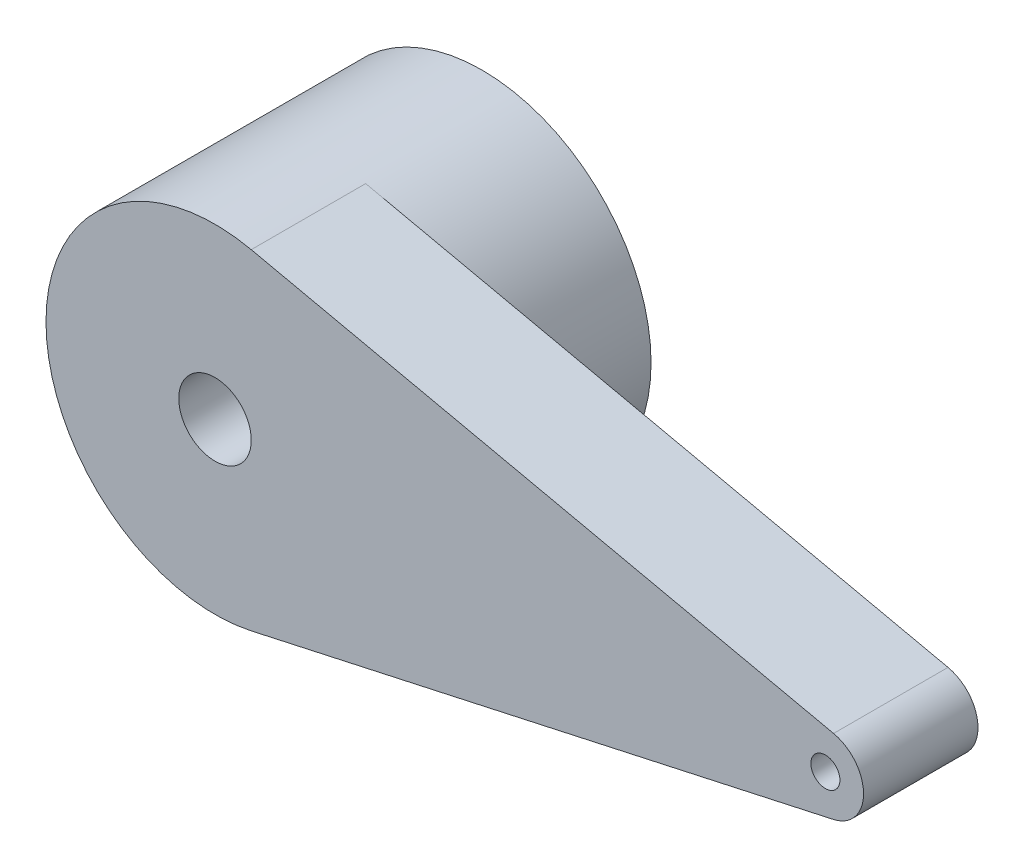
ISO-10303-21;
HEADER;
FILE_DESCRIPTION(('STEP AP214'),'2;1');
FILE_NAME('part.step','',(''),(''),'','','');
FILE_SCHEMA(('AUTOMOTIVE_DESIGN { 1 0 10303 214 1 1 1 1 }'));
ENDSEC;
DATA;
#1=APPLICATION_CONTEXT('core data for automotive mechanical design processes');
#2=APPLICATION_PROTOCOL_DEFINITION('international standard','automotive_design',2000,#1);
#3=PRODUCT_CONTEXT('',#1,'mechanical');
#4=PRODUCT('Part','Part','',(#3));
#5=PRODUCT_RELATED_PRODUCT_CATEGORY('part','',(#4));
#6=PRODUCT_DEFINITION_FORMATION('','',#4);
#7=PRODUCT_DEFINITION_CONTEXT('part definition',#1,'design');
#8=PRODUCT_DEFINITION('design','',#6,#7);
#9=PRODUCT_DEFINITION_SHAPE('','',#8);
#10=(LENGTH_UNIT() NAMED_UNIT(*) SI_UNIT(.MILLI.,.METRE.));
#11=(NAMED_UNIT(*) PLANE_ANGLE_UNIT() SI_UNIT($,.RADIAN.));
#12=(NAMED_UNIT(*) SI_UNIT($,.STERADIAN.) SOLID_ANGLE_UNIT());
#13=UNCERTAINTY_MEASURE_WITH_UNIT(LENGTH_MEASURE(1.E-05),#10,'distance_accuracy_value','');
#14=(GEOMETRIC_REPRESENTATION_CONTEXT(3) GLOBAL_UNCERTAINTY_ASSIGNED_CONTEXT((#13)) GLOBAL_UNIT_ASSIGNED_CONTEXT((#10,
#11,#12)) REPRESENTATION_CONTEXT('',''));
#15=CARTESIAN_POINT('',(0.,0.,0.));
#16=DIRECTION('',(0.,0.,1.));
#17=DIRECTION('',(1.,0.,0.));
#18=AXIS2_PLACEMENT_3D('',#15,#16,#17);
#19=CARTESIAN_POINT('',(0.,0.,0.));
#20=DIRECTION('',(0.,0.,1.));
#21=DIRECTION('',(1.,0.,0.));
#22=AXIS2_PLACEMENT_3D('',#19,#20,#21);
#23=PLANE('',#22);
#24=CARTESIAN_POINT('',(16.,0.,0.));
#25=DIRECTION('',(0.,0.,1.));
#26=DIRECTION('',(1.,0.,0.));
#27=AXIS2_PLACEMENT_3D('',#24,#25,#26);
#28=CIRCLE('',#27,0.380999999999998);
#29=CARTESIAN_POINT('',(16.381,0.,0.));
#30=VERTEX_POINT('',#29);
#31=EDGE_CURVE('E120',#30,#30,#28,.T.);
#32=ORIENTED_EDGE('',*,*,#31,.T.);
#33=EDGE_LOOP('',(#32));
#34=FACE_BOUND('',#33,.T.);
#35=CARTESIAN_POINT('',(0.,0.,0.));
#36=DIRECTION('',(0.,0.,-1.));
#37=DIRECTION('',(-1.,0.,0.));
#38=AXIS2_PLACEMENT_3D('',#35,#36,#37);
#39=CIRCLE('',#38,4.43);
#40=CARTESIAN_POINT('',(0.949681249999999,4.32700884253758,0.));
#41=VERTEX_POINT('',#40);
#42=CARTESIAN_POINT('',(0.949681250000001,-4.32700884253758,0.));
#43=VERTEX_POINT('',#42);
#44=EDGE_CURVE('E83',#41,#43,#39,.T.);
#45=ORIENTED_EDGE('',*,*,#44,.F.);
#46=DIRECTION('',(-0.976751431724059,0.214375,0.));
#47=VECTOR('',#46,1.);
#48=CARTESIAN_POINT('',(0.949681249999999,4.32700884253758,0.));
#49=LINE('',#48,#47);
#50=CARTESIAN_POINT('',(16.214375,0.976751431724059,0.));
#51=VERTEX_POINT('',#50);
#52=EDGE_CURVE('E85',#51,#41,#49,.T.);
#53=ORIENTED_EDGE('',*,*,#52,.F.);
#54=CARTESIAN_POINT('',(16.,0.,0.));
#55=DIRECTION('',(0.,0.,1.));
#56=DIRECTION('',(-1.,0.,0.));
#57=AXIS2_PLACEMENT_3D('',#54,#55,#56);
#58=CIRCLE('',#57,0.999999999999999);
#59=CARTESIAN_POINT('',(16.214375,-0.976751431724059,0.));
#60=VERTEX_POINT('',#59);
#61=EDGE_CURVE('E73',#60,#51,#58,.T.);
#62=ORIENTED_EDGE('',*,*,#61,.F.);
#63=DIRECTION('',(0.97675143172406,0.214375,0.));
#64=VECTOR('',#63,1.);
#65=CARTESIAN_POINT('',(16.214375,-0.976751431724059,0.));
#66=LINE('',#65,#64);
#67=EDGE_CURVE('E66',#43,#60,#66,.T.);
#68=ORIENTED_EDGE('',*,*,#67,.F.);
#69=EDGE_LOOP('',(#45,#53,#62,#68));
#70=FACE_BOUND('',#69,.T.);
#71=ADVANCED_FACE('F33',(#34,#70),#23,.F.);
#72=CARTESIAN_POINT('',(0.,0.,3.));
#73=DIRECTION('',(0.,0.,1.));
#74=DIRECTION('',(1.,0.,0.));
#75=AXIS2_PLACEMENT_3D('',#72,#73,#74);
#76=PLANE('',#75);
#77=CARTESIAN_POINT('',(16.,0.,3.));
#78=DIRECTION('',(0.,0.,1.));
#79=DIRECTION('',(1.,0.,0.));
#80=AXIS2_PLACEMENT_3D('',#77,#78,#79);
#81=CIRCLE('',#80,0.380999999999998);
#82=CARTESIAN_POINT('',(16.381,0.,3.));
#83=VERTEX_POINT('',#82);
#84=EDGE_CURVE('E111',#83,#83,#81,.T.);
#85=ORIENTED_EDGE('',*,*,#84,.F.);
#86=EDGE_LOOP('',(#85));
#87=FACE_BOUND('',#86,.T.);
#88=CARTESIAN_POINT('',(0.,0.,3.));
#89=DIRECTION('',(0.,0.,1.));
#90=DIRECTION('',(1.,0.,0.));
#91=AXIS2_PLACEMENT_3D('',#88,#89,#90);
#92=CIRCLE('',#91,4.43);
#93=CARTESIAN_POINT('',(0.949681249999999,4.32700884253758,3.));
#94=VERTEX_POINT('',#93);
#95=CARTESIAN_POINT('',(0.949681250000001,-4.32700884253758,3.));
#96=VERTEX_POINT('',#95);
#97=EDGE_CURVE('E97',#94,#96,#92,.T.);
#98=ORIENTED_EDGE('',*,*,#97,.T.);
#99=DIRECTION('',(0.97675143172406,0.214375,0.));
#100=VECTOR('',#99,1.);
#101=CARTESIAN_POINT('',(16.214375,-0.976751431724059,3.));
#102=LINE('',#101,#100);
#103=CARTESIAN_POINT('',(16.214375,-0.976751431724059,3.));
#104=VERTEX_POINT('',#103);
#105=EDGE_CURVE('E78',#96,#104,#102,.T.);
#106=ORIENTED_EDGE('',*,*,#105,.T.);
#107=CARTESIAN_POINT('',(16.,0.,3.));
#108=DIRECTION('',(0.,0.,1.));
#109=DIRECTION('',(-1.,0.,0.));
#110=AXIS2_PLACEMENT_3D('',#107,#108,#109);
#111=CIRCLE('',#110,0.999999999999999);
#112=CARTESIAN_POINT('',(16.214375,0.976751431724059,3.));
#113=VERTEX_POINT('',#112);
#114=EDGE_CURVE('E101',#104,#113,#111,.T.);
#115=ORIENTED_EDGE('',*,*,#114,.T.);
#116=DIRECTION('',(-0.976751431724059,0.214375,0.));
#117=VECTOR('',#116,1.);
#118=CARTESIAN_POINT('',(0.949681249999999,4.32700884253758,3.));
#119=LINE('',#118,#117);
#120=EDGE_CURVE('E52',#113,#94,#119,.T.);
#121=ORIENTED_EDGE('',*,*,#120,.T.);
#122=EDGE_LOOP('',(#98,#106,#115,#121));
#123=FACE_BOUND('',#122,.T.);
#124=CARTESIAN_POINT('',(0.,0.,3.));
#125=DIRECTION('',(0.,0.,1.));
#126=DIRECTION('',(1.,0.,0.));
#127=AXIS2_PLACEMENT_3D('',#124,#125,#126);
#128=CIRCLE('',#127,0.95);
#129=CARTESIAN_POINT('',(0.95,0.,3.));
#130=VERTEX_POINT('',#129);
#131=EDGE_CURVE('E117',#130,#130,#128,.T.);
#132=ORIENTED_EDGE('',*,*,#131,.F.);
#133=EDGE_LOOP('',(#132));
#134=FACE_BOUND('',#133,.T.);
#135=ADVANCED_FACE('F132',(#87,#123,#134),#76,.T.);
#136=CARTESIAN_POINT('',(0.,0.,0.));
#137=DIRECTION('',(0.,0.,-1.));
#138=DIRECTION('',(-1.,0.,0.));
#139=AXIS2_PLACEMENT_3D('',#136,#137,#138);
#140=CIRCLE('',#139,2.43);
#141=CARTESIAN_POINT('',(-2.43,0.,0.));
#142=VERTEX_POINT('',#141);
#143=EDGE_CURVE('E161',#142,#142,#140,.T.);
#144=ORIENTED_EDGE('',*,*,#143,.T.);
#145=EDGE_LOOP('',(#144));
#146=FACE_BOUND('',#145,.T.);
#147=CARTESIAN_POINT('',(0.,0.,0.));
#148=DIRECTION('',(0.,0.,1.));
#149=DIRECTION('',(1.,0.,0.));
#150=AXIS2_PLACEMENT_3D('',#147,#148,#149);
#151=CIRCLE('',#150,0.95);
#152=CARTESIAN_POINT('',(0.95,0.,0.));
#153=VERTEX_POINT('',#152);
#154=EDGE_CURVE('E121',#153,#153,#151,.T.);
#155=ORIENTED_EDGE('',*,*,#154,.T.);
#156=EDGE_LOOP('',(#155));
#157=FACE_BOUND('',#156,.T.);
#158=ADVANCED_FACE('F147',(#146,#157),#23,.F.);
#159=CARTESIAN_POINT('',(0.,0.,3.));
#160=DIRECTION('',(0.,0.,-1.));
#161=DIRECTION('',(-1.,0.,0.));
#162=AXIS2_PLACEMENT_3D('',#159,#160,#161);
#163=CYLINDRICAL_SURFACE('',#162,4.43);
#164=DIRECTION('',(0.,0.,-1.));
#165=VECTOR('',#164,1.);
#166=CARTESIAN_POINT('',(0.949681249999999,4.32700884253758,3.));
#167=LINE('',#166,#165);
#168=EDGE_CURVE('E94',#94,#41,#167,.T.);
#169=ORIENTED_EDGE('',*,*,#168,.T.);
#170=ORIENTED_EDGE('',*,*,#44,.T.);
#171=DIRECTION('',(0.,0.,-1.));
#172=VECTOR('',#171,1.);
#173=CARTESIAN_POINT('',(0.949681250000001,-4.32700884253758,3.));
#174=LINE('',#173,#172);
#175=EDGE_CURVE('E11',#96,#43,#174,.T.);
#176=ORIENTED_EDGE('',*,*,#175,.F.);
#177=ORIENTED_EDGE('',*,*,#97,.F.);
#178=EDGE_LOOP('',(#169,#170,#176,#177));
#179=FACE_BOUND('',#178,.T.);
#180=CARTESIAN_POINT('',(0.,0.,-4.));
#181=DIRECTION('',(0.,0.,-1.));
#182=DIRECTION('',(-1.,0.,0.));
#183=AXIS2_PLACEMENT_3D('',#180,#181,#182);
#184=CIRCLE('',#183,4.43);
#185=CARTESIAN_POINT('',(-4.43,0.,-4.));
#186=VERTEX_POINT('',#185);
#187=EDGE_CURVE('E89',#186,#186,#184,.T.);
#188=ORIENTED_EDGE('',*,*,#187,.F.);
#189=EDGE_LOOP('',(#188));
#190=FACE_BOUND('',#189,.T.);
#191=ADVANCED_FACE('F35',(#179,#190),#163,.T.);
#192=CARTESIAN_POINT('',(16.214375,-0.976751431724059,3.));
#193=DIRECTION('',(-0.214375,0.976751431724059,0.));
#194=DIRECTION('',(-0.97675143172406,-0.214375,0.));
#195=AXIS2_PLACEMENT_3D('',#192,#193,#194);
#196=PLANE('',#195);
#197=ORIENTED_EDGE('',*,*,#67,.T.);
#198=DIRECTION('',(0.,0.,-1.));
#199=VECTOR('',#198,1.);
#200=CARTESIAN_POINT('',(16.214375,-0.976751431724059,3.));
#201=LINE('',#200,#199);
#202=EDGE_CURVE('E43',#104,#60,#201,.T.);
#203=ORIENTED_EDGE('',*,*,#202,.F.);
#204=ORIENTED_EDGE('',*,*,#105,.F.);
#205=ORIENTED_EDGE('',*,*,#175,.T.);
#206=EDGE_LOOP('',(#197,#203,#204,#205));
#207=FACE_BOUND('',#206,.T.);
#208=ADVANCED_FACE('F136',(#207),#196,.F.);
#209=CARTESIAN_POINT('',(16.,0.,3.));
#210=DIRECTION('',(0.,0.,-1.));
#211=DIRECTION('',(-1.,0.,0.));
#212=AXIS2_PLACEMENT_3D('',#209,#210,#211);
#213=CYLINDRICAL_SURFACE('',#212,0.999999999999999);
#214=ORIENTED_EDGE('',*,*,#61,.T.);
#215=DIRECTION('',(0.,0.,-1.));
#216=VECTOR('',#215,1.);
#217=CARTESIAN_POINT('',(16.214375,0.976751431724059,3.));
#218=LINE('',#217,#216);
#219=EDGE_CURVE('E96',#113,#51,#218,.T.);
#220=ORIENTED_EDGE('',*,*,#219,.F.);
#221=ORIENTED_EDGE('',*,*,#114,.F.);
#222=ORIENTED_EDGE('',*,*,#202,.T.);
#223=EDGE_LOOP('',(#214,#220,#221,#222));
#224=FACE_BOUND('',#223,.T.);
#225=ADVANCED_FACE('F134',(#224),#213,.T.);
#226=CARTESIAN_POINT('',(0.949681249999999,4.32700884253758,3.));
#227=DIRECTION('',(-0.214375,-0.976751431724059,0.));
#228=DIRECTION('',(0.97675143172406,-0.214375,0.));
#229=AXIS2_PLACEMENT_3D('',#226,#227,#228);
#230=PLANE('',#229);
#231=ORIENTED_EDGE('',*,*,#52,.T.);
#232=ORIENTED_EDGE('',*,*,#168,.F.);
#233=ORIENTED_EDGE('',*,*,#120,.F.);
#234=ORIENTED_EDGE('',*,*,#219,.T.);
#235=EDGE_LOOP('',(#231,#232,#233,#234));
#236=FACE_BOUND('',#235,.T.);
#237=ADVANCED_FACE('F93',(#236),#230,.F.);
#238=CARTESIAN_POINT('',(16.,0.,3.));
#239=DIRECTION('',(0.,0.,-1.));
#240=DIRECTION('',(-1.,0.,0.));
#241=AXIS2_PLACEMENT_3D('',#238,#239,#240);
#242=CYLINDRICAL_SURFACE('',#241,0.380999999999998);
#243=ORIENTED_EDGE('',*,*,#84,.T.);
#244=EDGE_LOOP('',(#243));
#245=FACE_BOUND('',#244,.T.);
#246=ORIENTED_EDGE('',*,*,#31,.F.);
#247=EDGE_LOOP('',(#246));
#248=FACE_BOUND('',#247,.T.);
#249=ADVANCED_FACE('F142',(#245,#248),#242,.F.);
#250=CARTESIAN_POINT('',(0.,0.,3.));
#251=DIRECTION('',(0.,0.,-1.));
#252=DIRECTION('',(-1.,0.,0.));
#253=AXIS2_PLACEMENT_3D('',#250,#251,#252);
#254=CYLINDRICAL_SURFACE('',#253,0.95);
#255=ORIENTED_EDGE('',*,*,#131,.T.);
#256=EDGE_LOOP('',(#255));
#257=FACE_BOUND('',#256,.T.);
#258=ORIENTED_EDGE('',*,*,#154,.F.);
#259=EDGE_LOOP('',(#258));
#260=FACE_BOUND('',#259,.T.);
#261=ADVANCED_FACE('F164',(#257,#260),#254,.F.);
#262=CARTESIAN_POINT('',(0.,0.,-4.));
#263=DIRECTION('',(0.,0.,-1.));
#264=DIRECTION('',(-1.,0.,0.));
#265=AXIS2_PLACEMENT_3D('',#262,#263,#264);
#266=PLANE('',#265);
#267=ORIENTED_EDGE('',*,*,#187,.T.);
#268=EDGE_LOOP('',(#267));
#269=FACE_BOUND('',#268,.T.);
#270=CARTESIAN_POINT('',(0.,0.,-4.));
#271=DIRECTION('',(0.,0.,-1.));
#272=DIRECTION('',(-1.,0.,0.));
#273=AXIS2_PLACEMENT_3D('',#270,#271,#272);
#274=CIRCLE('',#273,2.43);
#275=CARTESIAN_POINT('',(-2.43,0.,-4.));
#276=VERTEX_POINT('',#275);
#277=EDGE_CURVE('E90',#276,#276,#274,.T.);
#278=ORIENTED_EDGE('',*,*,#277,.F.);
#279=EDGE_LOOP('',(#278));
#280=FACE_BOUND('',#279,.T.);
#281=ADVANCED_FACE('F166',(#269,#280),#266,.T.);
#282=CARTESIAN_POINT('',(0.,0.,-4.));
#283=DIRECTION('',(0.,0.,1.));
#284=DIRECTION('',(1.,0.,0.));
#285=AXIS2_PLACEMENT_3D('',#282,#283,#284);
#286=CYLINDRICAL_SURFACE('',#285,2.43);
#287=ORIENTED_EDGE('',*,*,#277,.T.);
#288=EDGE_LOOP('',(#287));
#289=FACE_BOUND('',#288,.T.);
#290=ORIENTED_EDGE('',*,*,#143,.F.);
#291=EDGE_LOOP('',(#290));
#292=FACE_BOUND('',#291,.T.);
#293=ADVANCED_FACE('F173',(#289,#292),#286,.F.);
#294=CLOSED_SHELL('',(#71,#135,#158,#191,#208,#225,#237,#249,#261,#281,#293));
#295=MANIFOLD_SOLID_BREP('B2',#294);
#296=ADVANCED_BREP_SHAPE_REPRESENTATION('',(#18,#295),#14);
#297=SHAPE_DEFINITION_REPRESENTATION(#9,#296);
ENDSEC;
END-ISO-10303-21;
